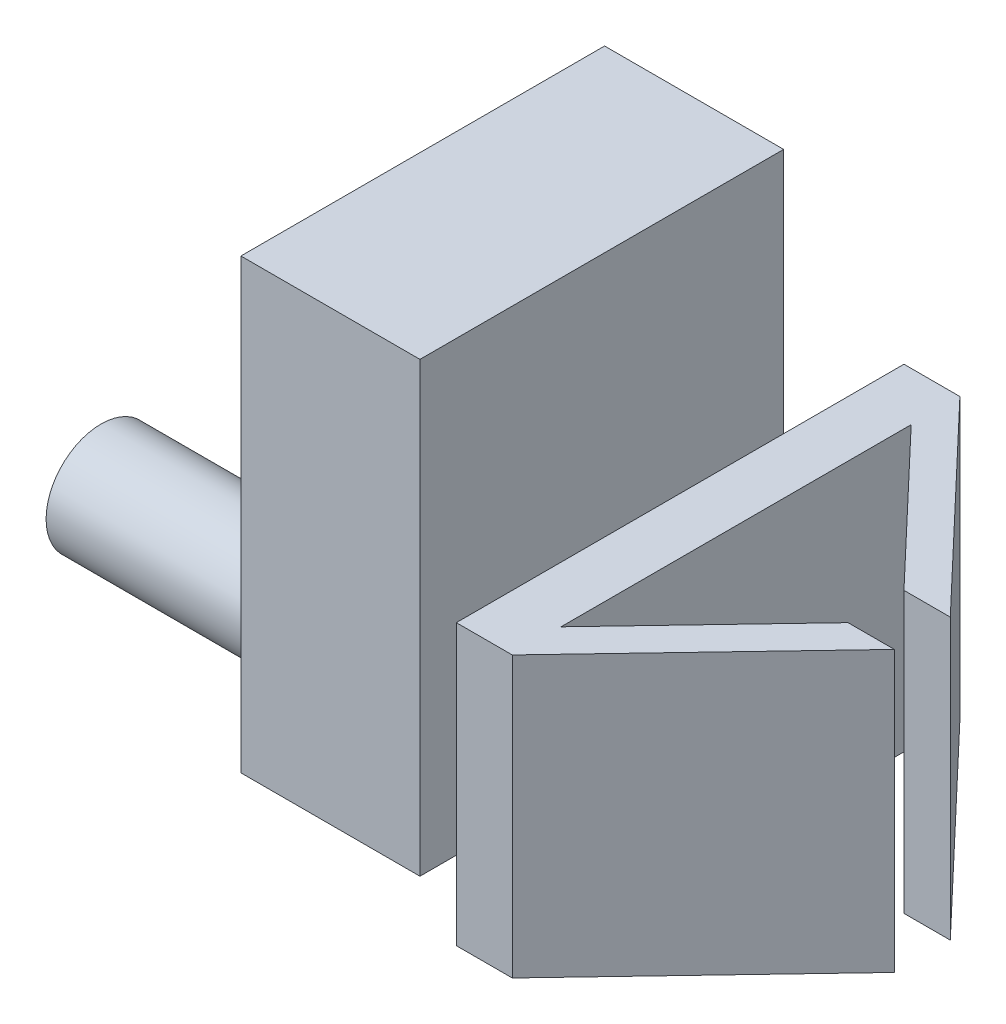
ISO-10303-21;
HEADER;
FILE_DESCRIPTION(('STEP AP214'),'2;1');
FILE_NAME('part.step','',(''),(''),'','','');
FILE_SCHEMA(('AUTOMOTIVE_DESIGN { 1 0 10303 214 1 1 1 1 }'));
ENDSEC;
DATA;
#1=APPLICATION_CONTEXT('core data for automotive mechanical design processes');
#2=APPLICATION_PROTOCOL_DEFINITION('international standard','automotive_design',2000,#1);
#3=PRODUCT_CONTEXT('',#1,'mechanical');
#4=PRODUCT('Part','Part','',(#3));
#5=PRODUCT_RELATED_PRODUCT_CATEGORY('part','',(#4));
#6=PRODUCT_DEFINITION_FORMATION('','',#4);
#7=PRODUCT_DEFINITION_CONTEXT('part definition',#1,'design');
#8=PRODUCT_DEFINITION('design','',#6,#7);
#9=PRODUCT_DEFINITION_SHAPE('','',#8);
#10=(LENGTH_UNIT() NAMED_UNIT(*) SI_UNIT(.MILLI.,.METRE.));
#11=(NAMED_UNIT(*) PLANE_ANGLE_UNIT() SI_UNIT($,.RADIAN.));
#12=(NAMED_UNIT(*) SI_UNIT($,.STERADIAN.) SOLID_ANGLE_UNIT());
#13=UNCERTAINTY_MEASURE_WITH_UNIT(LENGTH_MEASURE(1.E-05),#10,'distance_accuracy_value','');
#14=(GEOMETRIC_REPRESENTATION_CONTEXT(3) GLOBAL_UNCERTAINTY_ASSIGNED_CONTEXT((#13)) GLOBAL_UNIT_ASSIGNED_CONTEXT((#10,
#11,#12)) REPRESENTATION_CONTEXT('',''));
#15=CARTESIAN_POINT('',(0.,0.,0.));
#16=DIRECTION('',(0.,0.,1.));
#17=DIRECTION('',(1.,0.,0.));
#18=AXIS2_PLACEMENT_3D('',#15,#16,#17);
#19=CARTESIAN_POINT('',(4.064,20.32,8.255));
#20=DIRECTION('',(-1.,0.,0.));
#21=DIRECTION('',(0.,0.,1.));
#22=AXIS2_PLACEMENT_3D('',#19,#20,#21);
#23=PLANE('',#22);
#24=DIRECTION('',(0.,-1.,0.));
#25=VECTOR('',#24,1.);
#26=CARTESIAN_POINT('',(4.064,3.81,4.445));
#27=LINE('',#26,#25);
#28=CARTESIAN_POINT('',(4.064,5.08,4.445));
#29=VERTEX_POINT('',#28);
#30=CARTESIAN_POINT('',(4.064,0.,4.445));
#31=VERTEX_POINT('',#30);
#32=EDGE_CURVE('E244',#29,#31,#27,.T.);
#33=ORIENTED_EDGE('',*,*,#32,.F.);
#34=DIRECTION('',(0.,0.,1.));
#35=VECTOR('',#34,1.);
#36=CARTESIAN_POINT('',(4.064,5.08,-4.445));
#37=LINE('',#36,#35);
#38=CARTESIAN_POINT('',(4.064,5.08,-4.445));
#39=VERTEX_POINT('',#38);
#40=EDGE_CURVE('E316',#29,#39,#37,.F.);
#41=ORIENTED_EDGE('',*,*,#40,.T.);
#42=DIRECTION('',(0.,1.,0.));
#43=VECTOR('',#42,1.);
#44=CARTESIAN_POINT('',(4.064,3.81,-4.445));
#45=LINE('',#44,#43);
#46=CARTESIAN_POINT('',(4.064,0.,-4.445));
#47=VERTEX_POINT('',#46);
#48=EDGE_CURVE('E262',#47,#39,#45,.T.);
#49=ORIENTED_EDGE('',*,*,#48,.F.);
#50=DIRECTION('',(0.,0.,-1.));
#51=VECTOR('',#50,1.);
#52=CARTESIAN_POINT('',(4.064,0.,8.255));
#53=LINE('',#52,#51);
#54=CARTESIAN_POINT('',(4.064,0.,-8.255));
#55=VERTEX_POINT('',#54);
#56=EDGE_CURVE('E292',#47,#55,#53,.T.);
#57=ORIENTED_EDGE('',*,*,#56,.T.);
#58=DIRECTION('',(0.,-1.,0.));
#59=VECTOR('',#58,1.);
#60=CARTESIAN_POINT('',(4.064,20.32,-8.255));
#61=LINE('',#60,#59);
#62=CARTESIAN_POINT('',(4.064,20.32,-8.255));
#63=VERTEX_POINT('',#62);
#64=EDGE_CURVE('E298',#63,#55,#61,.T.);
#65=ORIENTED_EDGE('',*,*,#64,.F.);
#66=DIRECTION('',(0.,0.,-1.));
#67=VECTOR('',#66,1.);
#68=CARTESIAN_POINT('',(4.064,20.32,8.255));
#69=LINE('',#68,#67);
#70=CARTESIAN_POINT('',(4.064,20.32,8.255));
#71=VERTEX_POINT('',#70);
#72=EDGE_CURVE('E283',#71,#63,#69,.T.);
#73=ORIENTED_EDGE('',*,*,#72,.F.);
#74=DIRECTION('',(0.,-1.,0.));
#75=VECTOR('',#74,1.);
#76=CARTESIAN_POINT('',(4.064,20.32,8.255));
#77=LINE('',#76,#75);
#78=CARTESIAN_POINT('',(4.064,0.,8.255));
#79=VERTEX_POINT('',#78);
#80=EDGE_CURVE('E301',#71,#79,#77,.T.);
#81=ORIENTED_EDGE('',*,*,#80,.T.);
#82=EDGE_CURVE('E293',#79,#31,#53,.T.);
#83=ORIENTED_EDGE('',*,*,#82,.T.);
#84=EDGE_LOOP('',(#33,#41,#49,#57,#65,#73,#81,#83));
#85=FACE_BOUND('',#84,.T.);
#86=ADVANCED_FACE('F35',(#85),#23,.F.);
#87=CARTESIAN_POINT('',(-4.064,20.32,8.255));
#88=DIRECTION('',(1.,0.,0.));
#89=DIRECTION('',(0.,0.,-1.));
#90=AXIS2_PLACEMENT_3D('',#87,#88,#89);
#91=PLANE('',#90);
#92=CARTESIAN_POINT('',(-4.064,4.23708047729221,4.445));
#93=DIRECTION('',(1.,0.,0.));
#94=DIRECTION('',(0.,0.,-1.));
#95=AXIS2_PLACEMENT_3D('',#92,#93,#94);
#96=CIRCLE('',#95,3.76315592214363);
#97=CARTESIAN_POINT('',(-4.064,4.23708047729221,0.681844077856366));
#98=VERTEX_POINT('',#97);
#99=EDGE_CURVE('E310',#98,#98,#96,.T.);
#100=ORIENTED_EDGE('',*,*,#99,.T.);
#101=EDGE_LOOP('',(#100));
#102=FACE_BOUND('',#101,.T.);
#103=DIRECTION('',(0.,0.,1.));
#104=VECTOR('',#103,1.);
#105=CARTESIAN_POINT('',(-4.064,0.,8.255));
#106=LINE('',#105,#104);
#107=CARTESIAN_POINT('',(-4.064,0.,-8.255));
#108=VERTEX_POINT('',#107);
#109=CARTESIAN_POINT('',(-4.064,0.,8.255));
#110=VERTEX_POINT('',#109);
#111=EDGE_CURVE('E276',#108,#110,#106,.T.);
#112=ORIENTED_EDGE('',*,*,#111,.T.);
#113=DIRECTION('',(0.,-1.,0.));
#114=VECTOR('',#113,1.);
#115=CARTESIAN_POINT('',(-4.064,20.32,8.255));
#116=LINE('',#115,#114);
#117=CARTESIAN_POINT('',(-4.064,20.32,8.255));
#118=VERTEX_POINT('',#117);
#119=EDGE_CURVE('E304',#118,#110,#116,.T.);
#120=ORIENTED_EDGE('',*,*,#119,.F.);
#121=DIRECTION('',(0.,0.,1.));
#122=VECTOR('',#121,1.);
#123=CARTESIAN_POINT('',(-4.064,20.32,8.255));
#124=LINE('',#123,#122);
#125=CARTESIAN_POINT('',(-4.064,20.32,-8.255));
#126=VERTEX_POINT('',#125);
#127=EDGE_CURVE('E277',#126,#118,#124,.T.);
#128=ORIENTED_EDGE('',*,*,#127,.F.);
#129=DIRECTION('',(0.,-1.,0.));
#130=VECTOR('',#129,1.);
#131=CARTESIAN_POINT('',(-4.064,20.32,-8.255));
#132=LINE('',#131,#130);
#133=EDGE_CURVE('E287',#126,#108,#132,.T.);
#134=ORIENTED_EDGE('',*,*,#133,.T.);
#135=EDGE_LOOP('',(#112,#120,#128,#134));
#136=FACE_BOUND('',#135,.T.);
#137=ADVANCED_FACE('F385',(#102,#136),#91,.F.);
#138=CARTESIAN_POINT('',(4.064,20.32,8.255));
#139=DIRECTION('',(0.,0.,-1.));
#140=DIRECTION('',(-1.,0.,0.));
#141=AXIS2_PLACEMENT_3D('',#138,#139,#140);
#142=PLANE('',#141);
#143=DIRECTION('',(1.,0.,0.));
#144=VECTOR('',#143,1.);
#145=CARTESIAN_POINT('',(4.064,0.,8.255));
#146=LINE('',#145,#144);
#147=EDGE_CURVE('E290',#110,#79,#146,.T.);
#148=ORIENTED_EDGE('',*,*,#147,.T.);
#149=ORIENTED_EDGE('',*,*,#80,.F.);
#150=DIRECTION('',(1.,0.,0.));
#151=VECTOR('',#150,1.);
#152=CARTESIAN_POINT('',(4.064,20.32,8.255));
#153=LINE('',#152,#151);
#154=EDGE_CURVE('E280',#118,#71,#153,.T.);
#155=ORIENTED_EDGE('',*,*,#154,.F.);
#156=ORIENTED_EDGE('',*,*,#119,.T.);
#157=EDGE_LOOP('',(#148,#149,#155,#156));
#158=FACE_BOUND('',#157,.T.);
#159=ADVANCED_FACE('F383',(#158),#142,.F.);
#160=CARTESIAN_POINT('',(4.064,20.32,-8.255));
#161=DIRECTION('',(0.,0.,1.));
#162=DIRECTION('',(1.,0.,0.));
#163=AXIS2_PLACEMENT_3D('',#160,#161,#162);
#164=PLANE('',#163);
#165=DIRECTION('',(-1.,0.,0.));
#166=VECTOR('',#165,1.);
#167=CARTESIAN_POINT('',(4.064,0.,-8.255));
#168=LINE('',#167,#166);
#169=EDGE_CURVE('E281',#55,#108,#168,.T.);
#170=ORIENTED_EDGE('',*,*,#169,.T.);
#171=ORIENTED_EDGE('',*,*,#133,.F.);
#172=DIRECTION('',(-1.,0.,0.));
#173=VECTOR('',#172,1.);
#174=CARTESIAN_POINT('',(4.064,20.32,-8.255));
#175=LINE('',#174,#173);
#176=EDGE_CURVE('E285',#63,#126,#175,.T.);
#177=ORIENTED_EDGE('',*,*,#176,.F.);
#178=ORIENTED_EDGE('',*,*,#64,.T.);
#179=EDGE_LOOP('',(#170,#171,#177,#178));
#180=FACE_BOUND('',#179,.T.);
#181=ADVANCED_FACE('F375',(#180),#164,.F.);
#182=CARTESIAN_POINT('',(0.,20.32,0.));
#183=DIRECTION('',(0.,1.,0.));
#184=DIRECTION('',(0.,0.,1.));
#185=AXIS2_PLACEMENT_3D('',#182,#183,#184);
#186=PLANE('',#185);
#187=ORIENTED_EDGE('',*,*,#127,.T.);
#188=ORIENTED_EDGE('',*,*,#154,.T.);
#189=ORIENTED_EDGE('',*,*,#72,.T.);
#190=ORIENTED_EDGE('',*,*,#176,.T.);
#191=EDGE_LOOP('',(#187,#188,#189,#190));
#192=FACE_BOUND('',#191,.T.);
#193=ADVANCED_FACE('F379',(#192),#186,.T.);
#194=CARTESIAN_POINT('',(0.,0.,0.));
#195=DIRECTION('',(0.,1.,0.));
#196=DIRECTION('',(0.,0.,1.));
#197=AXIS2_PLACEMENT_3D('',#194,#195,#196);
#198=PLANE('',#197);
#199=ORIENTED_EDGE('',*,*,#111,.F.);
#200=ORIENTED_EDGE('',*,*,#169,.F.);
#201=ORIENTED_EDGE('',*,*,#56,.F.);
#202=DIRECTION('',(-1.,0.,0.));
#203=VECTOR('',#202,1.);
#204=CARTESIAN_POINT('',(7.62,0.,-4.445));
#205=LINE('',#204,#203);
#206=CARTESIAN_POINT('',(7.62,0.,-4.445));
#207=VERTEX_POINT('',#206);
#208=EDGE_CURVE('E264',#207,#47,#205,.T.);
#209=ORIENTED_EDGE('',*,*,#208,.F.);
#210=DIRECTION('',(0.,0.,-1.));
#211=VECTOR('',#210,1.);
#212=CARTESIAN_POINT('',(7.62,0.,10.16));
#213=LINE('',#212,#211);
#214=CARTESIAN_POINT('',(7.62,0.,-10.16));
#215=VERTEX_POINT('',#214);
#216=EDGE_CURVE('E222',#207,#215,#213,.T.);
#217=ORIENTED_EDGE('',*,*,#216,.T.);
#218=DIRECTION('',(1.,0.,0.));
#219=VECTOR('',#218,1.);
#220=CARTESIAN_POINT('',(10.16,0.,-10.16));
#221=LINE('',#220,#219);
#222=CARTESIAN_POINT('',(10.16,0.,-10.16));
#223=VERTEX_POINT('',#222);
#224=EDGE_CURVE('E226',#215,#223,#221,.T.);
#225=ORIENTED_EDGE('',*,*,#224,.T.);
#226=DIRECTION('',(0.689068633487753,0.,0.724696086882854));
#227=VECTOR('',#226,1.);
#228=CARTESIAN_POINT('',(10.16,0.,-10.16));
#229=LINE('',#228,#227);
#230=CARTESIAN_POINT('',(18.6129505024033,0.,-1.27));
#231=VERTEX_POINT('',#230);
#232=EDGE_CURVE('E229',#223,#231,#229,.T.);
#233=ORIENTED_EDGE('',*,*,#232,.T.);
#234=DIRECTION('',(-1.,0.,0.));
#235=VECTOR('',#234,1.);
#236=CARTESIAN_POINT('',(16.51,0.,-1.27));
#237=LINE('',#236,#235);
#238=CARTESIAN_POINT('',(16.51,0.,-1.27));
#239=VERTEX_POINT('',#238);
#240=EDGE_CURVE('E232',#231,#239,#237,.T.);
#241=ORIENTED_EDGE('',*,*,#240,.T.);
#242=DIRECTION('',(-0.689068633487753,0.,-0.724696086882854));
#243=VECTOR('',#242,1.);
#244=CARTESIAN_POINT('',(16.51,0.,-1.27));
#245=LINE('',#244,#243);
#246=CARTESIAN_POINT('',(10.16,0.,-7.94831900635761));
#247=VERTEX_POINT('',#246);
#248=EDGE_CURVE('E235',#239,#247,#245,.T.);
#249=ORIENTED_EDGE('',*,*,#248,.T.);
#250=DIRECTION('',(0.,0.,1.));
#251=VECTOR('',#250,1.);
#252=CARTESIAN_POINT('',(10.16,0.,7.94831900635761));
#253=LINE('',#252,#251);
#254=CARTESIAN_POINT('',(10.16,0.,7.94831900635761));
#255=VERTEX_POINT('',#254);
#256=EDGE_CURVE('E238',#247,#255,#253,.T.);
#257=ORIENTED_EDGE('',*,*,#256,.T.);
#258=DIRECTION('',(0.689068633487753,0.,-0.724696086882854));
#259=VECTOR('',#258,1.);
#260=CARTESIAN_POINT('',(16.51,0.,1.27));
#261=LINE('',#260,#259);
#262=CARTESIAN_POINT('',(16.51,0.,1.27));
#263=VERTEX_POINT('',#262);
#264=EDGE_CURVE('E196',#255,#263,#261,.T.);
#265=ORIENTED_EDGE('',*,*,#264,.T.);
#266=DIRECTION('',(1.,0.,0.));
#267=VECTOR('',#266,1.);
#268=CARTESIAN_POINT('',(16.51,0.,1.27));
#269=LINE('',#268,#267);
#270=CARTESIAN_POINT('',(18.6129505024033,0.,1.27));
#271=VERTEX_POINT('',#270);
#272=EDGE_CURVE('E193',#263,#271,#269,.T.);
#273=ORIENTED_EDGE('',*,*,#272,.T.);
#274=DIRECTION('',(-0.689068633487753,0.,0.724696086882854));
#275=VECTOR('',#274,1.);
#276=CARTESIAN_POINT('',(10.16,0.,10.16));
#277=LINE('',#276,#275);
#278=CARTESIAN_POINT('',(10.16,0.,10.16));
#279=VERTEX_POINT('',#278);
#280=EDGE_CURVE('E219',#271,#279,#277,.T.);
#281=ORIENTED_EDGE('',*,*,#280,.T.);
#282=DIRECTION('',(-1.,0.,0.));
#283=VECTOR('',#282,1.);
#284=CARTESIAN_POINT('',(10.16,0.,10.16));
#285=LINE('',#284,#283);
#286=CARTESIAN_POINT('',(7.62,0.,10.16));
#287=VERTEX_POINT('',#286);
#288=EDGE_CURVE('E172',#279,#287,#285,.T.);
#289=ORIENTED_EDGE('',*,*,#288,.T.);
#290=CARTESIAN_POINT('',(7.62,0.,4.445));
#291=VERTEX_POINT('',#290);
#292=EDGE_CURVE('E223',#287,#291,#213,.T.);
#293=ORIENTED_EDGE('',*,*,#292,.T.);
#294=DIRECTION('',(-1.,0.,0.));
#295=VECTOR('',#294,1.);
#296=CARTESIAN_POINT('',(7.62,0.,4.445));
#297=LINE('',#296,#295);
#298=EDGE_CURVE('E270',#291,#31,#297,.T.);
#299=ORIENTED_EDGE('',*,*,#298,.T.);
#300=ORIENTED_EDGE('',*,*,#82,.F.);
#301=ORIENTED_EDGE('',*,*,#147,.F.);
#302=EDGE_LOOP('',(#199,#200,#201,#209,#217,#225,#233,#241,#249,#257,#265,#273,#281,#289,#293,
#299,#300,#301));
#303=FACE_BOUND('',#302,.T.);
#304=ADVANCED_FACE('F344',(#303),#198,.F.);
#305=CARTESIAN_POINT('',(-14.224,4.23708047729221,4.445));
#306=DIRECTION('',(1.,0.,0.));
#307=DIRECTION('',(0.,0.,-1.));
#308=AXIS2_PLACEMENT_3D('',#305,#306,#307);
#309=CYLINDRICAL_SURFACE('',#308,2.49315592214363);
#310=CARTESIAN_POINT('',(-5.334,4.23708047729221,4.445));
#311=DIRECTION('',(1.,0.,0.));
#312=DIRECTION('',(0.,0.,-1.));
#313=AXIS2_PLACEMENT_3D('',#310,#311,#312);
#314=CIRCLE('',#313,2.49315592214363);
#315=CARTESIAN_POINT('',(-5.334,4.23708047729221,1.95184407785637));
#316=VERTEX_POINT('',#315);
#317=EDGE_CURVE('E307',#316,#316,#314,.F.);
#318=ORIENTED_EDGE('',*,*,#317,.T.);
#319=EDGE_LOOP('',(#318));
#320=FACE_BOUND('',#319,.T.);
#321=CARTESIAN_POINT('',(-14.224,4.23708047729221,4.445));
#322=DIRECTION('',(-1.,0.,0.));
#323=DIRECTION('',(0.,0.,1.));
#324=AXIS2_PLACEMENT_3D('',#321,#322,#323);
#325=CIRCLE('',#324,2.49315592214363);
#326=CARTESIAN_POINT('',(-14.224,4.23708047729221,6.93815592214363));
#327=VERTEX_POINT('',#326);
#328=EDGE_CURVE('E273',#327,#327,#325,.T.);
#329=ORIENTED_EDGE('',*,*,#328,.F.);
#330=EDGE_LOOP('',(#329));
#331=FACE_BOUND('',#330,.T.);
#332=ADVANCED_FACE('F415',(#320,#331),#309,.T.);
#333=CARTESIAN_POINT('',(-14.224,4.23708047729221,4.445));
#334=DIRECTION('',(-1.,0.,0.));
#335=DIRECTION('',(0.,0.,1.));
#336=AXIS2_PLACEMENT_3D('',#333,#334,#335);
#337=PLANE('',#336);
#338=ORIENTED_EDGE('',*,*,#328,.T.);
#339=EDGE_LOOP('',(#338));
#340=FACE_BOUND('',#339,.T.);
#341=ADVANCED_FACE('F398',(#340),#337,.T.);
#342=CARTESIAN_POINT('',(-5.334,4.23708047729221,4.445));
#343=DIRECTION('',(1.,0.,0.));
#344=DIRECTION('',(0.,0.,-1.));
#345=AXIS2_PLACEMENT_3D('',#342,#343,#344);
#346=TOROIDAL_SURFACE('',#345,3.76315592214363,1.27);
#347=ORIENTED_EDGE('',*,*,#99,.F.);
#348=EDGE_LOOP('',(#347));
#349=FACE_BOUND('',#348,.T.);
#350=ORIENTED_EDGE('',*,*,#317,.F.);
#351=EDGE_LOOP('',(#350));
#352=FACE_BOUND('',#351,.T.);
#353=ADVANCED_FACE('F396',(#349,#352),#346,.F.);
#354=CARTESIAN_POINT('',(7.62,3.81,4.445));
#355=DIRECTION('',(0.,0.,-1.));
#356=DIRECTION('',(0.,1.,0.));
#357=AXIS2_PLACEMENT_3D('',#354,#355,#356);
#358=PLANE('',#357);
#359=ORIENTED_EDGE('',*,*,#32,.T.);
#360=ORIENTED_EDGE('',*,*,#298,.F.);
#361=DIRECTION('',(0.,-1.,0.));
#362=VECTOR('',#361,1.);
#363=CARTESIAN_POINT('',(7.62,3.81,4.445));
#364=LINE('',#363,#362);
#365=CARTESIAN_POINT('',(7.62,7.30192267955635,4.445));
#366=VERTEX_POINT('',#365);
#367=EDGE_CURVE('E50',#366,#291,#364,.T.);
#368=ORIENTED_EDGE('',*,*,#367,.F.);
#369=CARTESIAN_POINT('',(3.81,7.30192267955635,4.445));
#370=DIRECTION('',(0.,0.,-1.));
#371=DIRECTION('',(0.,1.,0.));
#372=AXIS2_PLACEMENT_3D('',#369,#370,#371);
#373=CIRCLE('',#372,3.81);
#374=CARTESIAN_POINT('',(5.334,3.81,4.445));
#375=VERTEX_POINT('',#374);
#376=EDGE_CURVE('E43',#366,#375,#373,.T.);
#377=ORIENTED_EDGE('',*,*,#376,.T.);
#378=CARTESIAN_POINT('',(5.334,5.08,4.445));
#379=DIRECTION('',(0.,0.,-1.));
#380=DIRECTION('',(0.,1.,0.));
#381=AXIS2_PLACEMENT_3D('',#378,#379,#380);
#382=CIRCLE('',#381,1.27);
#383=EDGE_CURVE('E319',#375,#29,#382,.T.);
#384=ORIENTED_EDGE('',*,*,#383,.T.);
#385=EDGE_LOOP('',(#359,#360,#368,#377,#384));
#386=FACE_BOUND('',#385,.T.);
#387=ADVANCED_FACE('F326',(#386),#358,.F.);
#388=CARTESIAN_POINT('',(7.62,3.81,-4.445));
#389=DIRECTION('',(0.,0.,1.));
#390=DIRECTION('',(1.,0.,0.));
#391=AXIS2_PLACEMENT_3D('',#388,#389,#390);
#392=PLANE('',#391);
#393=ORIENTED_EDGE('',*,*,#48,.T.);
#394=CARTESIAN_POINT('',(5.334,5.08,-4.445));
#395=DIRECTION('',(0.,0.,1.));
#396=DIRECTION('',(1.,0.,0.));
#397=AXIS2_PLACEMENT_3D('',#394,#395,#396);
#398=CIRCLE('',#397,1.27);
#399=CARTESIAN_POINT('',(5.334,3.81,-4.445));
#400=VERTEX_POINT('',#399);
#401=EDGE_CURVE('E322',#39,#400,#398,.T.);
#402=ORIENTED_EDGE('',*,*,#401,.T.);
#403=CARTESIAN_POINT('',(3.81,7.30192267955635,-4.445));
#404=DIRECTION('',(0.,0.,1.));
#405=DIRECTION('',(1.,0.,0.));
#406=AXIS2_PLACEMENT_3D('',#403,#404,#405);
#407=CIRCLE('',#406,3.81);
#408=CARTESIAN_POINT('',(7.62,7.30192267955635,-4.445));
#409=VERTEX_POINT('',#408);
#410=EDGE_CURVE('E11',#400,#409,#407,.T.);
#411=ORIENTED_EDGE('',*,*,#410,.T.);
#412=DIRECTION('',(0.,1.,0.));
#413=VECTOR('',#412,1.);
#414=CARTESIAN_POINT('',(7.62,3.81,-4.445));
#415=LINE('',#414,#413);
#416=EDGE_CURVE('E58',#207,#409,#415,.T.);
#417=ORIENTED_EDGE('',*,*,#416,.F.);
#418=ORIENTED_EDGE('',*,*,#208,.T.);
#419=EDGE_LOOP('',(#393,#402,#411,#417,#418));
#420=FACE_BOUND('',#419,.T.);
#421=ADVANCED_FACE('F336',(#420),#392,.F.);
#422=CARTESIAN_POINT('',(5.334,5.08,4.445));
#423=DIRECTION('',(0.,0.,-1.));
#424=DIRECTION('',(-1.,0.,0.));
#425=AXIS2_PLACEMENT_3D('',#422,#423,#424);
#426=CYLINDRICAL_SURFACE('',#425,1.27);
#427=ORIENTED_EDGE('',*,*,#401,.F.);
#428=ORIENTED_EDGE('',*,*,#40,.F.);
#429=ORIENTED_EDGE('',*,*,#383,.F.);
#430=DIRECTION('',(0.,0.,1.));
#431=VECTOR('',#430,1.);
#432=CARTESIAN_POINT('',(5.334,3.81,4.445));
#433=LINE('',#432,#431);
#434=EDGE_CURVE('E313',#400,#375,#433,.T.);
#435=ORIENTED_EDGE('',*,*,#434,.F.);
#436=EDGE_LOOP('',(#427,#428,#429,#435));
#437=FACE_BOUND('',#436,.T.);
#438=ADVANCED_FACE('F333',(#437),#426,.F.);
#439=CARTESIAN_POINT('',(10.16,12.7,10.16));
#440=DIRECTION('',(0.724696086882854,0.,0.689068633487753));
#441=DIRECTION('',(0.689068633487753,0.,-0.724696086882854));
#442=AXIS2_PLACEMENT_3D('',#439,#440,#441);
#443=PLANE('',#442);
#444=ORIENTED_EDGE('',*,*,#280,.F.);
#445=DIRECTION('',(0.,-1.,0.));
#446=VECTOR('',#445,1.);
#447=CARTESIAN_POINT('',(18.6129505024033,12.7,1.27));
#448=LINE('',#447,#446);
#449=CARTESIAN_POINT('',(18.6129505024033,12.7,1.27));
#450=VERTEX_POINT('',#449);
#451=EDGE_CURVE('E192',#450,#271,#448,.T.);
#452=ORIENTED_EDGE('',*,*,#451,.F.);
#453=DIRECTION('',(-0.689068633487753,0.,0.724696086882854));
#454=VECTOR('',#453,1.);
#455=CARTESIAN_POINT('',(10.16,12.7,10.16));
#456=LINE('',#455,#454);
#457=CARTESIAN_POINT('',(10.16,12.7,10.16));
#458=VERTEX_POINT('',#457);
#459=EDGE_CURVE('E185',#450,#458,#456,.T.);
#460=ORIENTED_EDGE('',*,*,#459,.T.);
#461=DIRECTION('',(0.,-1.,0.));
#462=VECTOR('',#461,1.);
#463=CARTESIAN_POINT('',(10.16,12.7,10.16));
#464=LINE('',#463,#462);
#465=EDGE_CURVE('E167',#458,#279,#464,.T.);
#466=ORIENTED_EDGE('',*,*,#465,.T.);
#467=EDGE_LOOP('',(#444,#452,#460,#466));
#468=FACE_BOUND('',#467,.T.);
#469=ADVANCED_FACE('F191',(#468),#443,.T.);
#470=CARTESIAN_POINT('',(16.51,12.7,1.27));
#471=DIRECTION('',(0.,0.,-1.));
#472=DIRECTION('',(-1.,0.,0.));
#473=AXIS2_PLACEMENT_3D('',#470,#471,#472);
#474=PLANE('',#473);
#475=ORIENTED_EDGE('',*,*,#272,.F.);
#476=DIRECTION('',(0.,-1.,0.));
#477=VECTOR('',#476,1.);
#478=CARTESIAN_POINT('',(16.51,12.7,1.27));
#479=LINE('',#478,#477);
#480=CARTESIAN_POINT('',(16.51,12.7,1.27));
#481=VERTEX_POINT('',#480);
#482=EDGE_CURVE('E245',#481,#263,#479,.T.);
#483=ORIENTED_EDGE('',*,*,#482,.F.);
#484=DIRECTION('',(1.,0.,0.));
#485=VECTOR('',#484,1.);
#486=CARTESIAN_POINT('',(16.51,12.7,1.27));
#487=LINE('',#486,#485);
#488=EDGE_CURVE('E178',#481,#450,#487,.T.);
#489=ORIENTED_EDGE('',*,*,#488,.T.);
#490=ORIENTED_EDGE('',*,*,#451,.T.);
#491=EDGE_LOOP('',(#475,#483,#489,#490));
#492=FACE_BOUND('',#491,.T.);
#493=ADVANCED_FACE('F348',(#492),#474,.T.);
#494=CARTESIAN_POINT('',(16.51,12.7,1.27));
#495=DIRECTION('',(-0.724696086882854,0.,-0.689068633487753));
#496=DIRECTION('',(-0.689068633487753,0.,0.724696086882854));
#497=AXIS2_PLACEMENT_3D('',#494,#495,#496);
#498=PLANE('',#497);
#499=ORIENTED_EDGE('',*,*,#264,.F.);
#500=DIRECTION('',(0.,-1.,0.));
#501=VECTOR('',#500,1.);
#502=CARTESIAN_POINT('',(10.16,12.7,7.94831900635761));
#503=LINE('',#502,#501);
#504=CARTESIAN_POINT('',(10.16,12.7,7.94831900635761));
#505=VERTEX_POINT('',#504);
#506=EDGE_CURVE('E247',#505,#255,#503,.T.);
#507=ORIENTED_EDGE('',*,*,#506,.F.);
#508=DIRECTION('',(0.689068633487753,0.,-0.724696086882854));
#509=VECTOR('',#508,1.);
#510=CARTESIAN_POINT('',(16.51,12.7,1.27));
#511=LINE('',#510,#509);
#512=EDGE_CURVE('E215',#505,#481,#511,.T.);
#513=ORIENTED_EDGE('',*,*,#512,.T.);
#514=ORIENTED_EDGE('',*,*,#482,.T.);
#515=EDGE_LOOP('',(#499,#507,#513,#514));
#516=FACE_BOUND('',#515,.T.);
#517=ADVANCED_FACE('F533',(#516),#498,.T.);
#518=CARTESIAN_POINT('',(10.16,12.7,7.94831900635761));
#519=DIRECTION('',(1.,0.,0.));
#520=DIRECTION('',(0.,0.,-1.));
#521=AXIS2_PLACEMENT_3D('',#518,#519,#520);
#522=PLANE('',#521);
#523=ORIENTED_EDGE('',*,*,#256,.F.);
#524=DIRECTION('',(0.,-1.,0.));
#525=VECTOR('',#524,1.);
#526=CARTESIAN_POINT('',(10.16,12.7,-7.94831900635761));
#527=LINE('',#526,#525);
#528=CARTESIAN_POINT('',(10.16,12.7,-7.94831900635761));
#529=VERTEX_POINT('',#528);
#530=EDGE_CURVE('E249',#529,#247,#527,.T.);
#531=ORIENTED_EDGE('',*,*,#530,.F.);
#532=DIRECTION('',(0.,0.,1.));
#533=VECTOR('',#532,1.);
#534=CARTESIAN_POINT('',(10.16,12.7,7.94831900635761));
#535=LINE('',#534,#533);
#536=EDGE_CURVE('E212',#529,#505,#535,.T.);
#537=ORIENTED_EDGE('',*,*,#536,.T.);
#538=ORIENTED_EDGE('',*,*,#506,.T.);
#539=EDGE_LOOP('',(#523,#531,#537,#538));
#540=FACE_BOUND('',#539,.T.);
#541=ADVANCED_FACE('F355',(#540),#522,.T.);
#542=CARTESIAN_POINT('',(16.51,12.7,-1.27));
#543=DIRECTION('',(-0.724696086882854,0.,0.689068633487752));
#544=DIRECTION('',(0.689068633487753,0.,0.724696086882854));
#545=AXIS2_PLACEMENT_3D('',#542,#543,#544);
#546=PLANE('',#545);
#547=ORIENTED_EDGE('',*,*,#248,.F.);
#548=DIRECTION('',(0.,-1.,0.));
#549=VECTOR('',#548,1.);
#550=CARTESIAN_POINT('',(16.51,12.7,-1.27));
#551=LINE('',#550,#549);
#552=CARTESIAN_POINT('',(16.51,12.7,-1.27));
#553=VERTEX_POINT('',#552);
#554=EDGE_CURVE('E251',#553,#239,#551,.T.);
#555=ORIENTED_EDGE('',*,*,#554,.F.);
#556=DIRECTION('',(-0.689068633487753,0.,-0.724696086882854));
#557=VECTOR('',#556,1.);
#558=CARTESIAN_POINT('',(16.51,12.7,-1.27));
#559=LINE('',#558,#557);
#560=EDGE_CURVE('E209',#553,#529,#559,.T.);
#561=ORIENTED_EDGE('',*,*,#560,.T.);
#562=ORIENTED_EDGE('',*,*,#530,.T.);
#563=EDGE_LOOP('',(#547,#555,#561,#562));
#564=FACE_BOUND('',#563,.T.);
#565=ADVANCED_FACE('F358',(#564),#546,.T.);
#566=CARTESIAN_POINT('',(16.51,12.7,-1.27));
#567=DIRECTION('',(0.,0.,1.));
#568=DIRECTION('',(1.,0.,0.));
#569=AXIS2_PLACEMENT_3D('',#566,#567,#568);
#570=PLANE('',#569);
#571=ORIENTED_EDGE('',*,*,#240,.F.);
#572=DIRECTION('',(0.,-1.,0.));
#573=VECTOR('',#572,1.);
#574=CARTESIAN_POINT('',(18.6129505024033,12.7,-1.27));
#575=LINE('',#574,#573);
#576=CARTESIAN_POINT('',(18.6129505024033,12.7,-1.27));
#577=VERTEX_POINT('',#576);
#578=EDGE_CURVE('E253',#577,#231,#575,.T.);
#579=ORIENTED_EDGE('',*,*,#578,.F.);
#580=DIRECTION('',(-1.,0.,0.));
#581=VECTOR('',#580,1.);
#582=CARTESIAN_POINT('',(16.51,12.7,-1.27));
#583=LINE('',#582,#581);
#584=EDGE_CURVE('E206',#577,#553,#583,.T.);
#585=ORIENTED_EDGE('',*,*,#584,.T.);
#586=ORIENTED_EDGE('',*,*,#554,.T.);
#587=EDGE_LOOP('',(#571,#579,#585,#586));
#588=FACE_BOUND('',#587,.T.);
#589=ADVANCED_FACE('F363',(#588),#570,.T.);
#590=CARTESIAN_POINT('',(10.16,12.7,-10.16));
#591=DIRECTION('',(0.724696086882854,0.,-0.689068633487753));
#592=DIRECTION('',(-0.689068633487753,0.,-0.724696086882854));
#593=AXIS2_PLACEMENT_3D('',#590,#591,#592);
#594=PLANE('',#593);
#595=ORIENTED_EDGE('',*,*,#232,.F.);
#596=DIRECTION('',(0.,-1.,0.));
#597=VECTOR('',#596,1.);
#598=CARTESIAN_POINT('',(10.16,12.7,-10.16));
#599=LINE('',#598,#597);
#600=CARTESIAN_POINT('',(10.16,12.7,-10.16));
#601=VERTEX_POINT('',#600);
#602=EDGE_CURVE('E255',#601,#223,#599,.T.);
#603=ORIENTED_EDGE('',*,*,#602,.F.);
#604=DIRECTION('',(0.689068633487753,0.,0.724696086882854));
#605=VECTOR('',#604,1.);
#606=CARTESIAN_POINT('',(10.16,12.7,-10.16));
#607=LINE('',#606,#605);
#608=EDGE_CURVE('E203',#601,#577,#607,.T.);
#609=ORIENTED_EDGE('',*,*,#608,.T.);
#610=ORIENTED_EDGE('',*,*,#578,.T.);
#611=EDGE_LOOP('',(#595,#603,#609,#610));
#612=FACE_BOUND('',#611,.T.);
#613=ADVANCED_FACE('F366',(#612),#594,.T.);
#614=CARTESIAN_POINT('',(10.16,12.7,-10.16));
#615=DIRECTION('',(0.,0.,-1.));
#616=DIRECTION('',(-1.,0.,0.));
#617=AXIS2_PLACEMENT_3D('',#614,#615,#616);
#618=PLANE('',#617);
#619=ORIENTED_EDGE('',*,*,#224,.F.);
#620=DIRECTION('',(0.,-1.,0.));
#621=VECTOR('',#620,1.);
#622=CARTESIAN_POINT('',(7.62,12.7,-10.16));
#623=LINE('',#622,#621);
#624=CARTESIAN_POINT('',(7.62,12.7,-10.16));
#625=VERTEX_POINT('',#624);
#626=EDGE_CURVE('E257',#625,#215,#623,.T.);
#627=ORIENTED_EDGE('',*,*,#626,.F.);
#628=DIRECTION('',(1.,0.,0.));
#629=VECTOR('',#628,1.);
#630=CARTESIAN_POINT('',(10.16,12.7,-10.16));
#631=LINE('',#630,#629);
#632=EDGE_CURVE('E200',#625,#601,#631,.T.);
#633=ORIENTED_EDGE('',*,*,#632,.T.);
#634=ORIENTED_EDGE('',*,*,#602,.T.);
#635=EDGE_LOOP('',(#619,#627,#633,#634));
#636=FACE_BOUND('',#635,.T.);
#637=ADVANCED_FACE('F369',(#636),#618,.T.);
#638=CARTESIAN_POINT('',(7.62,12.7,10.16));
#639=DIRECTION('',(-1.,0.,0.));
#640=DIRECTION('',(0.,0.,1.));
#641=AXIS2_PLACEMENT_3D('',#638,#639,#640);
#642=PLANE('',#641);
#643=DIRECTION('',(0.,0.,-1.));
#644=VECTOR('',#643,1.);
#645=CARTESIAN_POINT('',(7.62,7.30192267955635,4.445));
#646=LINE('',#645,#644);
#647=EDGE_CURVE('E324',#409,#366,#646,.F.);
#648=ORIENTED_EDGE('',*,*,#647,.T.);
#649=ORIENTED_EDGE('',*,*,#367,.T.);
#650=ORIENTED_EDGE('',*,*,#292,.F.);
#651=DIRECTION('',(0.,-1.,0.));
#652=VECTOR('',#651,1.);
#653=CARTESIAN_POINT('',(7.62,12.7,10.16));
#654=LINE('',#653,#652);
#655=CARTESIAN_POINT('',(7.62,12.7,10.16));
#656=VERTEX_POINT('',#655);
#657=EDGE_CURVE('E177',#656,#287,#654,.T.);
#658=ORIENTED_EDGE('',*,*,#657,.F.);
#659=DIRECTION('',(0.,0.,-1.));
#660=VECTOR('',#659,1.);
#661=CARTESIAN_POINT('',(7.62,12.7,10.16));
#662=LINE('',#661,#660);
#663=EDGE_CURVE('E189',#656,#625,#662,.T.);
#664=ORIENTED_EDGE('',*,*,#663,.T.);
#665=ORIENTED_EDGE('',*,*,#626,.T.);
#666=ORIENTED_EDGE('',*,*,#216,.F.);
#667=ORIENTED_EDGE('',*,*,#416,.T.);
#668=EDGE_LOOP('',(#648,#649,#650,#658,#664,#665,#666,#667));
#669=FACE_BOUND('',#668,.T.);
#670=ADVANCED_FACE('F342',(#669),#642,.T.);
#671=CARTESIAN_POINT('',(10.16,12.7,10.16));
#672=DIRECTION('',(0.,0.,1.));
#673=DIRECTION('',(1.,0.,0.));
#674=AXIS2_PLACEMENT_3D('',#671,#672,#673);
#675=PLANE('',#674);
#676=ORIENTED_EDGE('',*,*,#288,.F.);
#677=ORIENTED_EDGE('',*,*,#465,.F.);
#678=DIRECTION('',(-1.,0.,0.));
#679=VECTOR('',#678,1.);
#680=CARTESIAN_POINT('',(10.16,12.7,10.16));
#681=LINE('',#680,#679);
#682=EDGE_CURVE('E170',#458,#656,#681,.T.);
#683=ORIENTED_EDGE('',*,*,#682,.T.);
#684=ORIENTED_EDGE('',*,*,#657,.T.);
#685=EDGE_LOOP('',(#676,#677,#683,#684));
#686=FACE_BOUND('',#685,.T.);
#687=ADVANCED_FACE('F169',(#686),#675,.T.);
#688=CARTESIAN_POINT('',(0.,12.7,0.));
#689=DIRECTION('',(0.,1.,0.));
#690=DIRECTION('',(0.,0.,1.));
#691=AXIS2_PLACEMENT_3D('',#688,#689,#690);
#692=PLANE('',#691);
#693=ORIENTED_EDGE('',*,*,#459,.F.);
#694=ORIENTED_EDGE('',*,*,#488,.F.);
#695=ORIENTED_EDGE('',*,*,#512,.F.);
#696=ORIENTED_EDGE('',*,*,#536,.F.);
#697=ORIENTED_EDGE('',*,*,#560,.F.);
#698=ORIENTED_EDGE('',*,*,#584,.F.);
#699=ORIENTED_EDGE('',*,*,#608,.F.);
#700=ORIENTED_EDGE('',*,*,#632,.F.);
#701=ORIENTED_EDGE('',*,*,#663,.F.);
#702=ORIENTED_EDGE('',*,*,#682,.F.);
#703=EDGE_LOOP('',(#693,#694,#695,#696,#697,#698,#699,#700,#701,#702));
#704=FACE_BOUND('',#703,.T.);
#705=ADVANCED_FACE('F183',(#704),#692,.T.);
#706=CARTESIAN_POINT('',(3.81,7.30192267955635,4.445));
#707=DIRECTION('',(0.,0.,1.));
#708=DIRECTION('',(1.,0.,0.));
#709=AXIS2_PLACEMENT_3D('',#706,#707,#708);
#710=CYLINDRICAL_SURFACE('',#709,3.81);
#711=ORIENTED_EDGE('',*,*,#410,.F.);
#712=ORIENTED_EDGE('',*,*,#434,.T.);
#713=ORIENTED_EDGE('',*,*,#376,.F.);
#714=ORIENTED_EDGE('',*,*,#647,.F.);
#715=EDGE_LOOP('',(#711,#712,#713,#714));
#716=FACE_BOUND('',#715,.T.);
#717=ADVANCED_FACE('F37',(#716),#710,.F.);
#718=CLOSED_SHELL('',(#86,#137,#159,#181,#193,#304,#332,#341,#353,#387,#421,#438,#469,#493,#517,
#541,#565,#589,#613,#637,#670,#687,#705,#717));
#719=MANIFOLD_SOLID_BREP('B2',#718);
#720=ADVANCED_BREP_SHAPE_REPRESENTATION('',(#18,#719),#14);
#721=SHAPE_DEFINITION_REPRESENTATION(#9,#720);
ENDSEC;
END-ISO-10303-21;
